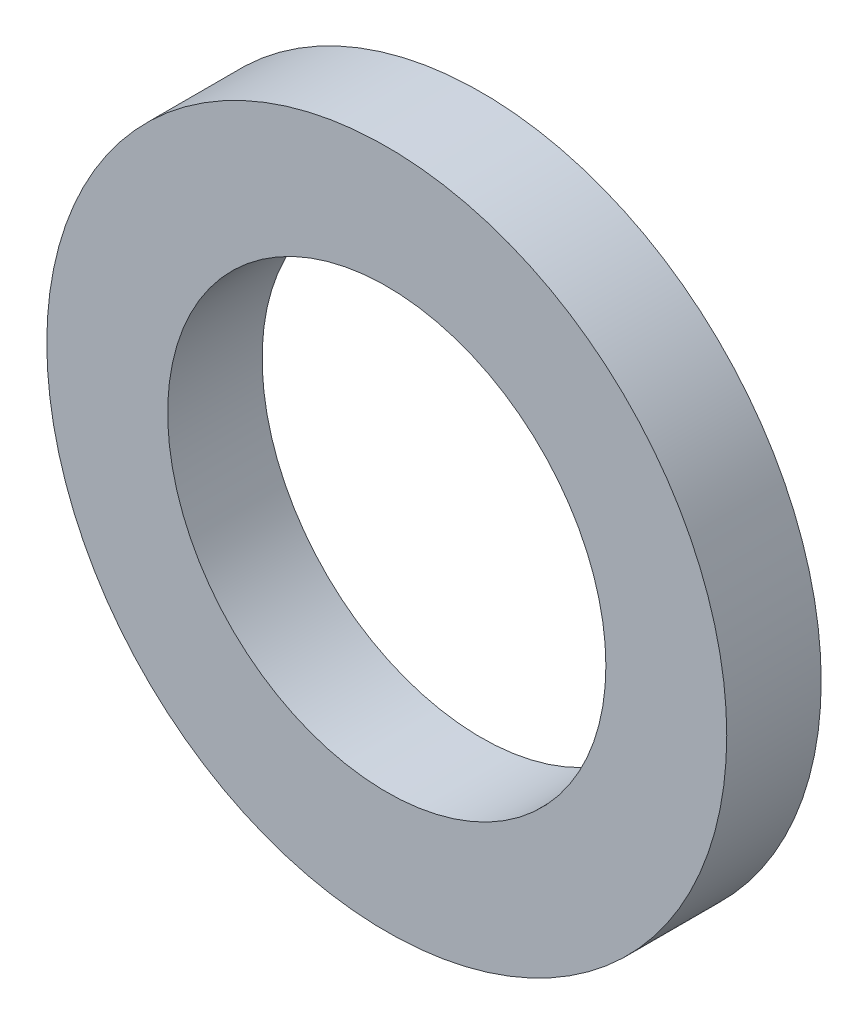
ISO-10303-21;
HEADER;
FILE_DESCRIPTION(('STEP AP214'),'2;1');
FILE_NAME('part.step','',(''),(''),'','','');
FILE_SCHEMA(('AUTOMOTIVE_DESIGN { 1 0 10303 214 1 1 1 1 }'));
ENDSEC;
DATA;
#1=APPLICATION_CONTEXT('core data for automotive mechanical design processes');
#2=APPLICATION_PROTOCOL_DEFINITION('international standard','automotive_design',2000,#1);
#3=PRODUCT_CONTEXT('',#1,'mechanical');
#4=PRODUCT('Part','Part','',(#3));
#5=PRODUCT_RELATED_PRODUCT_CATEGORY('part','',(#4));
#6=PRODUCT_DEFINITION_FORMATION('','',#4);
#7=PRODUCT_DEFINITION_CONTEXT('part definition',#1,'design');
#8=PRODUCT_DEFINITION('design','',#6,#7);
#9=PRODUCT_DEFINITION_SHAPE('','',#8);
#10=(LENGTH_UNIT() NAMED_UNIT(*) SI_UNIT(.MILLI.,.METRE.));
#11=(NAMED_UNIT(*) PLANE_ANGLE_UNIT() SI_UNIT($,.RADIAN.));
#12=(NAMED_UNIT(*) SI_UNIT($,.STERADIAN.) SOLID_ANGLE_UNIT());
#13=UNCERTAINTY_MEASURE_WITH_UNIT(LENGTH_MEASURE(1.E-05),#10,'distance_accuracy_value','');
#14=(GEOMETRIC_REPRESENTATION_CONTEXT(3) GLOBAL_UNCERTAINTY_ASSIGNED_CONTEXT((#13)) GLOBAL_UNIT_ASSIGNED_CONTEXT((#10,
#11,#12)) REPRESENTATION_CONTEXT('',''));
#15=CARTESIAN_POINT('',(0.,0.,0.));
#16=DIRECTION('',(0.,0.,1.));
#17=DIRECTION('',(1.,0.,0.));
#18=AXIS2_PLACEMENT_3D('',#15,#16,#17);
#19=CARTESIAN_POINT('',(0.,0.,2.5));
#20=DIRECTION('',(0.,0.,1.));
#21=DIRECTION('',(1.,0.,0.));
#22=AXIS2_PLACEMENT_3D('',#19,#20,#21);
#23=PLANE('',#22);
#24=CARTESIAN_POINT('',(0.,0.,2.5));
#25=DIRECTION('',(0.,0.,1.));
#26=DIRECTION('',(1.,0.,0.));
#27=AXIS2_PLACEMENT_3D('',#24,#25,#26);
#28=CIRCLE('',#27,9.);
#29=CARTESIAN_POINT('',(9.,0.,2.5));
#30=VERTEX_POINT('',#29);
#31=EDGE_CURVE('E10',#30,#30,#28,.T.);
#32=ORIENTED_EDGE('',*,*,#31,.T.);
#33=EDGE_LOOP('',(#32));
#34=FACE_BOUND('',#33,.T.);
#35=CARTESIAN_POINT('',(0.,0.,2.5));
#36=DIRECTION('',(0.,0.,1.));
#37=DIRECTION('',(1.,0.,0.));
#38=AXIS2_PLACEMENT_3D('',#35,#36,#37);
#39=CIRCLE('',#38,5.8);
#40=CARTESIAN_POINT('',(5.8,0.,2.5));
#41=VERTEX_POINT('',#40);
#42=EDGE_CURVE('E46',#41,#41,#39,.T.);
#43=ORIENTED_EDGE('',*,*,#42,.F.);
#44=EDGE_LOOP('',(#43));
#45=FACE_BOUND('',#44,.T.);
#46=ADVANCED_FACE('F35',(#34,#45),#23,.T.);
#47=CARTESIAN_POINT('',(0.,0.,0.));
#48=DIRECTION('',(0.,0.,1.));
#49=DIRECTION('',(1.,0.,0.));
#50=AXIS2_PLACEMENT_3D('',#47,#48,#49);
#51=PLANE('',#50);
#52=CARTESIAN_POINT('',(0.,0.,0.));
#53=DIRECTION('',(0.,0.,1.));
#54=DIRECTION('',(1.,0.,0.));
#55=AXIS2_PLACEMENT_3D('',#52,#53,#54);
#56=CIRCLE('',#55,9.);
#57=CARTESIAN_POINT('',(9.,0.,0.));
#58=VERTEX_POINT('',#57);
#59=EDGE_CURVE('E39',#58,#58,#56,.T.);
#60=ORIENTED_EDGE('',*,*,#59,.F.);
#61=EDGE_LOOP('',(#60));
#62=FACE_BOUND('',#61,.T.);
#63=CARTESIAN_POINT('',(0.,0.,0.));
#64=DIRECTION('',(0.,0.,1.));
#65=DIRECTION('',(1.,0.,0.));
#66=AXIS2_PLACEMENT_3D('',#63,#64,#65);
#67=CIRCLE('',#66,5.8);
#68=CARTESIAN_POINT('',(5.8,0.,0.));
#69=VERTEX_POINT('',#68);
#70=EDGE_CURVE('E48',#69,#69,#67,.T.);
#71=ORIENTED_EDGE('',*,*,#70,.T.);
#72=EDGE_LOOP('',(#71));
#73=FACE_BOUND('',#72,.T.);
#74=ADVANCED_FACE('F58',(#62,#73),#51,.F.);
#75=CARTESIAN_POINT('',(0.,0.,2.5));
#76=DIRECTION('',(0.,0.,-1.));
#77=DIRECTION('',(-1.,0.,0.));
#78=AXIS2_PLACEMENT_3D('',#75,#76,#77);
#79=CYLINDRICAL_SURFACE('',#78,9.);
#80=ORIENTED_EDGE('',*,*,#31,.F.);
#81=EDGE_LOOP('',(#80));
#82=FACE_BOUND('',#81,.T.);
#83=ORIENTED_EDGE('',*,*,#59,.T.);
#84=EDGE_LOOP('',(#83));
#85=FACE_BOUND('',#84,.T.);
#86=ADVANCED_FACE('F37',(#82,#85),#79,.T.);
#87=CARTESIAN_POINT('',(0.,0.,2.5));
#88=DIRECTION('',(0.,0.,-1.));
#89=DIRECTION('',(-1.,0.,0.));
#90=AXIS2_PLACEMENT_3D('',#87,#88,#89);
#91=CYLINDRICAL_SURFACE('',#90,5.8);
#92=ORIENTED_EDGE('',*,*,#42,.T.);
#93=EDGE_LOOP('',(#92));
#94=FACE_BOUND('',#93,.T.);
#95=ORIENTED_EDGE('',*,*,#70,.F.);
#96=EDGE_LOOP('',(#95));
#97=FACE_BOUND('',#96,.T.);
#98=ADVANCED_FACE('F54',(#94,#97),#91,.F.);
#99=CLOSED_SHELL('',(#46,#74,#86,#98));
#100=MANIFOLD_SOLID_BREP('B2',#99);
#101=ADVANCED_BREP_SHAPE_REPRESENTATION('',(#18,#100),#14);
#102=SHAPE_DEFINITION_REPRESENTATION(#9,#101);
ENDSEC;
END-ISO-10303-21;
